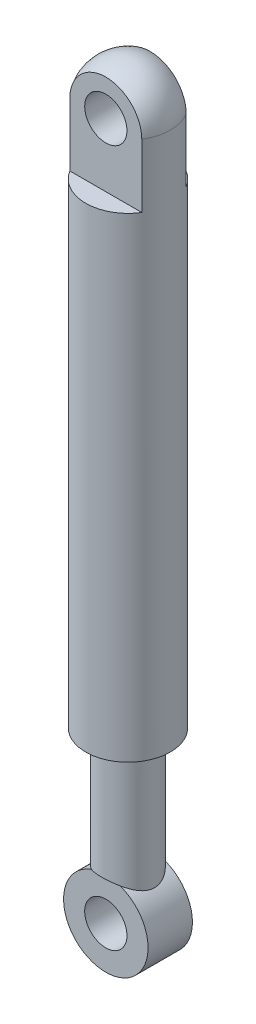
ISO-10303-21;
HEADER;
FILE_DESCRIPTION(('STEP AP214'),'2;1');
FILE_NAME('part.step','',(''),(''),'','','');
FILE_SCHEMA(('AUTOMOTIVE_DESIGN { 1 0 10303 214 1 1 1 1 }'));
ENDSEC;
DATA;
#1=APPLICATION_CONTEXT('core data for automotive mechanical design processes');
#2=APPLICATION_PROTOCOL_DEFINITION('international standard','automotive_design',2000,#1);
#3=PRODUCT_CONTEXT('',#1,'mechanical');
#4=PRODUCT('Part','Part','',(#3));
#5=PRODUCT_RELATED_PRODUCT_CATEGORY('part','',(#4));
#6=PRODUCT_DEFINITION_FORMATION('','',#4);
#7=PRODUCT_DEFINITION_CONTEXT('part definition',#1,'design');
#8=PRODUCT_DEFINITION('design','',#6,#7);
#9=PRODUCT_DEFINITION_SHAPE('','',#8);
#10=(LENGTH_UNIT() NAMED_UNIT(*) SI_UNIT(.MILLI.,.METRE.));
#11=(NAMED_UNIT(*) PLANE_ANGLE_UNIT() SI_UNIT($,.RADIAN.));
#12=(NAMED_UNIT(*) SI_UNIT($,.STERADIAN.) SOLID_ANGLE_UNIT());
#13=UNCERTAINTY_MEASURE_WITH_UNIT(LENGTH_MEASURE(1.E-05),#10,'distance_accuracy_value','');
#14=(GEOMETRIC_REPRESENTATION_CONTEXT(3) GLOBAL_UNCERTAINTY_ASSIGNED_CONTEXT((#13)) GLOBAL_UNIT_ASSIGNED_CONTEXT((#10,
#11,#12)) REPRESENTATION_CONTEXT('',''));
#15=CARTESIAN_POINT('',(0.,0.,0.));
#16=DIRECTION('',(0.,0.,1.));
#17=DIRECTION('',(1.,0.,0.));
#18=AXIS2_PLACEMENT_3D('',#15,#16,#17);
#19=CARTESIAN_POINT('',(0.,0.,0.));
#20=DIRECTION('',(0.,-1.,0.));
#21=DIRECTION('',(0.,0.,-1.));
#22=AXIS2_PLACEMENT_3D('',#19,#20,#21);
#23=CYLINDRICAL_SURFACE('',#22,4.00000000000001);
#24=CARTESIAN_POINT('',(0.,0.,0.));
#25=DIRECTION('',(0.,-1.,0.));
#26=DIRECTION('',(0.,0.,-1.));
#27=AXIS2_PLACEMENT_3D('',#24,#25,#26);
#28=CIRCLE('',#27,4.00000000000001);
#29=CARTESIAN_POINT('',(0.,0.,-4.00000000000001));
#30=VERTEX_POINT('',#29);
#31=EDGE_CURVE('E149',#30,#30,#28,.T.);
#32=ORIENTED_EDGE('',*,*,#31,.F.);
#33=EDGE_LOOP('',(#32));
#34=FACE_BOUND('',#33,.T.);
#35=CARTESIAN_POINT('',(0.,45.,0.));
#36=DIRECTION('',(0.,1.,0.));
#37=DIRECTION('',(0.,0.,1.));
#38=AXIS2_PLACEMENT_3D('',#35,#36,#37);
#39=CIRCLE('',#38,4.00000000000001);
#40=CARTESIAN_POINT('',(-3.40440890610985,45.,-2.1));
#41=VERTEX_POINT('',#40);
#42=CARTESIAN_POINT('',(3.40440890610985,45.,-2.1));
#43=VERTEX_POINT('',#42);
#44=EDGE_CURVE('E11',#41,#43,#39,.F.);
#45=ORIENTED_EDGE('',*,*,#44,.T.);
#46=DIRECTION('',(0.,-1.,0.));
#47=VECTOR('',#46,1.);
#48=CARTESIAN_POINT('',(3.40440890610985,0.,-2.09999999999999));
#49=LINE('',#48,#47);
#50=CARTESIAN_POINT('',(3.40440890610985,51.,-2.1));
#51=VERTEX_POINT('',#50);
#52=EDGE_CURVE('E102',#43,#51,#49,.F.);
#53=ORIENTED_EDGE('',*,*,#52,.T.);
#54=CARTESIAN_POINT('',(0.,51.,0.));
#55=DIRECTION('',(0.,-1.,0.));
#56=DIRECTION('',(0.,0.,-1.));
#57=AXIS2_PLACEMENT_3D('',#54,#55,#56);
#58=CIRCLE('',#57,4.00000000000001);
#59=CARTESIAN_POINT('',(3.40440890610985,51.,2.1));
#60=VERTEX_POINT('',#59);
#61=EDGE_CURVE('E146',#51,#60,#58,.T.);
#62=ORIENTED_EDGE('',*,*,#61,.T.);
#63=DIRECTION('',(0.,-1.,0.));
#64=VECTOR('',#63,1.);
#65=CARTESIAN_POINT('',(3.40440890610985,0.,2.09999999999999));
#66=LINE('',#65,#64);
#67=CARTESIAN_POINT('',(3.40440890610985,45.,2.1));
#68=VERTEX_POINT('',#67);
#69=EDGE_CURVE('E70',#68,#60,#66,.F.);
#70=ORIENTED_EDGE('',*,*,#69,.F.);
#71=CARTESIAN_POINT('',(0.,45.,0.));
#72=DIRECTION('',(0.,-1.,0.));
#73=DIRECTION('',(0.,0.,-1.));
#74=AXIS2_PLACEMENT_3D('',#71,#72,#73);
#75=CIRCLE('',#74,4.00000000000001);
#76=CARTESIAN_POINT('',(-3.40440890610985,45.,2.1));
#77=VERTEX_POINT('',#76);
#78=EDGE_CURVE('E65',#77,#68,#75,.F.);
#79=ORIENTED_EDGE('',*,*,#78,.F.);
#80=DIRECTION('',(0.,-1.,0.));
#81=VECTOR('',#80,1.);
#82=CARTESIAN_POINT('',(-3.40440890610985,0.,2.09999999999999));
#83=LINE('',#82,#81);
#84=CARTESIAN_POINT('',(-3.40440890610985,51.,2.1));
#85=VERTEX_POINT('',#84);
#86=EDGE_CURVE('E128',#85,#77,#83,.T.);
#87=ORIENTED_EDGE('',*,*,#86,.F.);
#88=CARTESIAN_POINT('',(-3.40440890610985,51.,-2.1));
#89=VERTEX_POINT('',#88);
#90=EDGE_CURVE('E120',#85,#89,#58,.T.);
#91=ORIENTED_EDGE('',*,*,#90,.T.);
#92=DIRECTION('',(0.,-1.,0.));
#93=VECTOR('',#92,1.);
#94=CARTESIAN_POINT('',(-3.40440890610985,0.,-2.09999999999999));
#95=LINE('',#94,#93);
#96=EDGE_CURVE('E111',#89,#41,#95,.T.);
#97=ORIENTED_EDGE('',*,*,#96,.T.);
#98=EDGE_LOOP('',(#45,#53,#62,#70,#79,#87,#91,#97));
#99=FACE_BOUND('',#98,.T.);
#100=ADVANCED_FACE('F47',(#34,#99),#23,.T.);
#101=CARTESIAN_POINT('',(0.,51.,0.));
#102=DIRECTION('',(0.,-1.,0.));
#103=DIRECTION('',(1.,0.,0.));
#104=AXIS2_PLACEMENT_3D('',#101,#102,#103);
#105=SPHERICAL_SURFACE('',#104,4.00000000000001);
#106=CARTESIAN_POINT('',(0.,51.,-2.1));
#107=DIRECTION('',(0.,0.,-1.));
#108=DIRECTION('',(0.,1.,0.));
#109=AXIS2_PLACEMENT_3D('',#106,#107,#108);
#110=CIRCLE('',#109,3.40440890610985);
#111=EDGE_CURVE('E57',#51,#89,#110,.F.);
#112=ORIENTED_EDGE('',*,*,#111,.T.);
#113=ORIENTED_EDGE('',*,*,#90,.F.);
#114=CARTESIAN_POINT('',(0.,51.,2.1));
#115=DIRECTION('',(0.,0.,-1.));
#116=DIRECTION('',(0.,1.,0.));
#117=AXIS2_PLACEMENT_3D('',#114,#115,#116);
#118=CIRCLE('',#117,3.40440890610985);
#119=EDGE_CURVE('E162',#60,#85,#118,.F.);
#120=ORIENTED_EDGE('',*,*,#119,.F.);
#121=ORIENTED_EDGE('',*,*,#61,.F.);
#122=EDGE_LOOP('',(#112,#113,#120,#121));
#123=FACE_BOUND('',#122,.T.);
#124=ADVANCED_FACE('F211',(#123),#105,.T.);
#125=CARTESIAN_POINT('',(0.,-15.,-4.00000000000001));
#126=DIRECTION('',(0.,0.,1.));
#127=DIRECTION('',(1.,0.,0.));
#128=AXIS2_PLACEMENT_3D('',#125,#126,#127);
#129=CYLINDRICAL_SURFACE('',#128,4.);
#130=CARTESIAN_POINT('',(0.,-15.,-2.1));
#131=DIRECTION('',(0.,0.,1.));
#132=DIRECTION('',(1.,0.,0.));
#133=AXIS2_PLACEMENT_3D('',#130,#131,#132);
#134=CIRCLE('',#133,4.);
#135=CARTESIAN_POINT('',(1.35646599662505,-11.2370224555546,-2.1));
#136=VERTEX_POINT('',#135);
#137=CARTESIAN_POINT('',(-1.35646599662505,-11.2370224555546,-2.1));
#138=VERTEX_POINT('',#137);
#139=EDGE_CURVE('E140',#136,#138,#134,.T.);
#140=ORIENTED_EDGE('',*,*,#139,.T.);
#141=CARTESIAN_POINT('',(-2.5,-11.8775010008008,0.));
#142=CARTESIAN_POINT('',(-2.49999941097139,-11.8775000844458,-0.0621567514455108));
#143=CARTESIAN_POINT('',(-2.49767581942173,-11.8756350926608,-0.124325946670792));
#144=CARTESIAN_POINT('',(-2.48843349840856,-11.8682707688097,-0.248117179547742));
#145=CARTESIAN_POINT('',(-2.48151206248433,-11.8627692961864,-0.309738873257102));
#146=CARTESIAN_POINT('',(-2.45397595058365,-11.841110464415,-0.493226047743712));
#147=CARTESIAN_POINT('',(-2.42658990946459,-11.8197996372886,-0.613548331188979));
#148=CARTESIAN_POINT('',(-2.35576217141197,-11.7670022923963,-0.845598197878236));
#149=CARTESIAN_POINT('',(-2.31245961359202,-11.7356042461679,-0.957390415055104));
#150=CARTESIAN_POINT('',(-2.21143916430899,-11.6663399911556,-1.17200852533406));
#151=CARTESIAN_POINT('',(-2.15372087963017,-11.6284736059447,-1.27483417375309));
#152=CARTESIAN_POINT('',(-2.01647682425577,-11.5444077487812,-1.48373398130366));
#153=CARTESIAN_POINT('',(-1.93506425666948,-11.4977718548842,-1.58839332500452));
#154=CARTESIAN_POINT('',(-1.75662526657431,-11.4049449646663,-1.7837615516238));
#155=CARTESIAN_POINT('',(-1.65958538899782,-11.3587543884156,-1.87445827995362));
#156=CARTESIAN_POINT('',(-1.43833990582854,-11.2654047522869,-2.05022029817268));
#157=CARTESIAN_POINT('',(-1.31226934259651,-11.218801122185,-2.13328618445043));
#158=CARTESIAN_POINT('',(-1.11163395543429,-11.1569274816123,-2.24054515473624));
#159=CARTESIAN_POINT('',(-1.04281240974104,-11.1376371690795,-2.27341513833311));
#160=CARTESIAN_POINT('',(-0.901758767615548,-11.1022956302456,-2.33295468536328));
#161=CARTESIAN_POINT('',(-0.829529068393795,-11.0862421679288,-2.35962853103842));
#162=CARTESIAN_POINT('',(-0.689700297916575,-11.0593324088618,-2.40398381525628));
#163=CARTESIAN_POINT('',(-0.622371981278587,-11.0481146401553,-2.42230197651811));
#164=CARTESIAN_POINT('',(-0.485997575898807,-11.0290375809084,-2.45330228631336));
#165=CARTESIAN_POINT('',(-0.416952503441681,-11.0211763512028,-2.46598768921621));
#166=CARTESIAN_POINT('',(-0.277765449857172,-11.0090452966526,-2.48551379763454));
#167=CARTESIAN_POINT('',(-0.207624174243904,-11.0047732515217,-2.49235811651341));
#168=CARTESIAN_POINT('',(-0.0669114466599372,-10.9999387492756,-2.50009921338922));
#169=CARTESIAN_POINT('',(0.00365995486028072,-10.9993758651775,-2.50099667596335));
#170=CARTESIAN_POINT('',(0.19604508155554,-11.002955203805,-2.49527462645275));
#171=CARTESIAN_POINT('',(0.317681845488537,-11.0108295910256,-2.48269349692112));
#172=CARTESIAN_POINT('',(0.556636494620257,-11.0370909672407,-2.44026978203388));
#173=CARTESIAN_POINT('',(0.673954052677428,-11.0554787507952,-2.41042589202638));
#174=CARTESIAN_POINT('',(0.901771991763868,-11.1012382928839,-2.33479144071674));
#175=CARTESIAN_POINT('',(1.01225407159607,-11.1286330261895,-2.28896008042893));
#176=CARTESIAN_POINT('',(1.22404012071223,-11.1902870824865,-2.18306276101571));
#177=CARTESIAN_POINT('',(1.32534199174245,-11.2245479691068,-2.12299355893635));
#178=CARTESIAN_POINT('',(1.52942649744659,-11.3021355875283,-1.98194358307633));
#179=CARTESIAN_POINT('',(1.63082454612907,-11.3460599361848,-1.89929072330952));
#180=CARTESIAN_POINT('',(1.81919733573063,-11.4360907225949,-1.71973526279293));
#181=CARTESIAN_POINT('',(1.90615071842624,-11.4822002642959,-1.62281195361603));
#182=CARTESIAN_POINT('',(2.07470887167909,-11.5785711653553,-1.40258874682652));
#183=CARTESIAN_POINT('',(2.15413229677844,-11.628588373134,-1.27749723664192));
#184=CARTESIAN_POINT('',(2.29052307550563,-11.7197172180762,-1.01270776269859));
#185=CARTESIAN_POINT('',(2.34753179448504,-11.7608451961307,-0.873037312546895));
#186=CARTESIAN_POINT('',(2.42437133527931,-11.8181624686824,-0.620461193893754));
#187=CARTESIAN_POINT('',(2.45003683445404,-11.8380659139749,-0.510178074786513));
#188=CARTESIAN_POINT('',(2.48620337073091,-11.8664172224045,-0.285769622440113));
#189=CARTESIAN_POINT('',(2.49672512520811,-11.8748807349556,-0.171649757343195));
#190=CARTESIAN_POINT('',(2.5019707209518,-11.8790773296932,0.0574573605024472));
#191=CARTESIAN_POINT('',(2.49665835896695,-11.8747812382981,0.172446000478453));
#192=CARTESIAN_POINT('',(2.47051466367814,-11.8540791416381,0.399561164318477));
#193=CARTESIAN_POINT('',(2.44967047849126,-11.8376631077709,0.511685238371181));
#194=CARTESIAN_POINT('',(2.39409874195038,-11.7953987920286,0.728436759425691));
#195=CARTESIAN_POINT('',(2.35960571424758,-11.7697104563218,0.833157315894324));
#196=CARTESIAN_POINT('',(2.27804893702243,-11.7116885161125,1.03557469989379));
#197=CARTESIAN_POINT('',(2.23098072583747,-11.6793525539792,1.13326901887797));
#198=CARTESIAN_POINT('',(2.11530798730694,-11.604255987148,1.33861194166319));
#199=CARTESIAN_POINT('',(2.04430931160544,-11.5606827570698,1.44461452730177));
#200=CARTESIAN_POINT('',(1.88737868921489,-11.4721205678666,1.64437066065426));
#201=CARTESIAN_POINT('',(1.80143124902619,-11.4271301799553,1.73811132124234));
#202=CARTESIAN_POINT('',(1.60076932492121,-11.332337905405,1.92596407064096));
#203=CARTESIAN_POINT('',(1.48365201617177,-11.282920661168,2.01772739848491));
#204=CARTESIAN_POINT('',(1.23256787407809,-11.1923102660139,2.18014701471972));
#205=CARTESIAN_POINT('',(1.09860897940974,-11.1511132638099,2.25081319512692));
#206=CARTESIAN_POINT('',(0.89193080465508,-11.1001103350022,2.33658106797499));
#207=CARTESIAN_POINT('',(0.824318196039419,-11.0852294490275,2.36129744395128));
#208=CARTESIAN_POINT('',(0.686640792876422,-11.0587535608138,2.40493827673228));
#209=CARTESIAN_POINT('',(0.616577444051134,-11.0471566568519,2.42386608615092));
#210=CARTESIAN_POINT('',(0.474639231464261,-11.0276148796005,2.45560583013925));
#211=CARTESIAN_POINT('',(0.402766005755506,-11.0196668209116,2.46842309951643));
#212=CARTESIAN_POINT('',(0.25788180714246,-11.0076583165666,2.48773917229289));
#213=CARTESIAN_POINT('',(0.184871024482533,-11.0035972277998,2.49423902093079));
#214=CARTESIAN_POINT('',(-0.0131102774248943,-10.9980847850729,2.50307151550711));
#215=CARTESIAN_POINT('',(-0.138539079205451,-11.0004729387605,2.49926579290941));
#216=CARTESIAN_POINT('',(-0.386583137102133,-11.0167802498164,2.47308241045447));
#217=CARTESIAN_POINT('',(-0.509198520626832,-11.0306988839514,2.45070559332119));
#218=CARTESIAN_POINT('',(-0.744080605483851,-11.0680791661572,2.38967758445389));
#219=CARTESIAN_POINT('',(-0.856558752631813,-11.091192989452,2.35161792643533));
#220=CARTESIAN_POINT('',(-1.07343034721918,-11.1451002875116,2.26088053755652));
#221=CARTESIAN_POINT('',(-1.17782242685803,-11.1758950578469,2.2082003404328));
#222=CARTESIAN_POINT('',(-1.38731297754797,-11.2464932606435,2.08367872128004));
#223=CARTESIAN_POINT('',(-1.4913601218378,-11.2868999813534,2.0104160092425));
#224=CARTESIAN_POINT('',(-1.68643334934803,-11.3713271601479,1.84984676748589));
#225=CARTESIAN_POINT('',(-1.77744451843681,-11.415351668088,1.76252439116572));
#226=CARTESIAN_POINT('',(-1.95744716561589,-11.5099917178028,1.56176748493813));
#227=CARTESIAN_POINT('',(-2.04425661250063,-11.560642615729,1.44638338742857));
#228=CARTESIAN_POINT('',(-2.19754648509904,-11.6565035254289,1.20071059024024));
#229=CARTESIAN_POINT('',(-2.26403815415027,-11.7017165379581,1.07043018884747));
#230=CARTESIAN_POINT('',(-2.3619822941284,-11.7714046021991,0.827194699215084));
#231=CARTESIAN_POINT('',(-2.39792458576829,-11.7982536066123,0.716729427846441));
#232=CARTESIAN_POINT('',(-2.45425618419746,-11.8412164189549,0.490060656998223));
#233=CARTESIAN_POINT('',(-2.47469472410168,-11.8573641884957,0.37387658020028));
#234=CARTESIAN_POINT('',(-2.49119847139522,-11.8704714235939,0.213940005353927));
#235=CARTESIAN_POINT('',(-2.49449433837959,-11.8731000569323,0.171274474291342));
#236=CARTESIAN_POINT('',(-2.49889558125807,-11.8766153806014,0.0857413010482517));
#237=CARTESIAN_POINT('',(-2.50000040629188,-11.8775016328713,0.0428736107566455));
#238=CARTESIAN_POINT('',(-2.5,-11.8775010008008,0.));
#239=B_SPLINE_CURVE_WITH_KNOTS('',3,(#141,#142,#143,#144,#145,#146,#147,#148,#149,#150,#151,
#152,#153,#154,#155,#156,#157,#158,#159,#160,#161,#162,#163,#164,#165,#166,#167,#168,#169,#170,
#171,#172,#173,#174,#175,#176,#177,#178,#179,#180,#181,#182,#183,#184,#185,#186,#187,#188,#189,
#190,#191,#192,#193,#194,#195,#196,#197,#198,#199,#200,#201,#202,#203,#204,#205,#206,#207,#208,
#209,#210,#211,#212,#213,#214,#215,#216,#217,#218,#219,#220,#221,#222,#223,#224,#225,#226,#227,
#228,#229,#230,#231,#232,#233,#234,#235,#236,#237,#238),.UNSPECIFIED.,.T.,.F.,(4,2,2,2,2,2,2,2,
2,2,2,2,2,2,2,2,2,2,2,2,2,2,2,2,2,2,2,2,2,2,2,2,2,2,2,2,2,2,2,2,2,2,2,2,2,2,2,2,4),(0.,
0.18641531585846,0.372940459994496,0.746478880764687,1.11682668423133,1.48718459072605,
1.90722798685071,2.32763499192879,2.7987602926597,3.03445880867314,3.26999394209509,
3.48170145743205,3.69328649746504,3.90474055342595,4.11617026725867,4.48184709708114,
4.84755156693919,5.21419620193004,5.58092442797434,5.99329080205307,6.40626158573465,
6.87316206383505,7.33919680735486,7.68265621505466,8.02564530559509,8.36941921026407,
8.7134778886509,9.05186495232125,9.390372235192,9.79332737765188,10.1967026751544,
10.6647326786671,11.1325428866818,11.3527929661039,11.5729152387446,11.7928449800804,
12.0127383271002,12.3871595324234,12.7615637480926,13.1229788842094,13.4844550226785,
13.8834503840958,14.2828986410983,14.7399238503459,15.1966956936287,15.5530255473292,
15.9082190611886,16.0367696833384,16.1653526209168),.UNSPECIFIED.);
#240=EDGE_CURVE('E154',#138,#136,#239,.T.);
#241=ORIENTED_EDGE('',*,*,#240,.T.);
#242=EDGE_LOOP('',(#140,#241));
#243=FACE_BOUND('',#242,.T.);
#244=ADVANCED_FACE('F174',(#243),#129,.F.);
#245=CARTESIAN_POINT('',(0.,0.,0.));
#246=DIRECTION('',(0.,-1.,0.));
#247=DIRECTION('',(0.,0.,-1.));
#248=AXIS2_PLACEMENT_3D('',#245,#246,#247);
#249=PLANE('',#248);
#250=CARTESIAN_POINT('',(0.,0.,0.));
#251=DIRECTION('',(0.,1.,0.));
#252=DIRECTION('',(-1.,0.,0.));
#253=AXIS2_PLACEMENT_3D('',#250,#251,#252);
#254=CIRCLE('',#253,2.5);
#255=CARTESIAN_POINT('',(-2.5,0.,0.));
#256=VERTEX_POINT('',#255);
#257=EDGE_CURVE('E138',#256,#256,#254,.T.);
#258=ORIENTED_EDGE('',*,*,#257,.T.);
#259=EDGE_LOOP('',(#258));
#260=FACE_BOUND('',#259,.T.);
#261=ORIENTED_EDGE('',*,*,#31,.T.);
#262=EDGE_LOOP('',(#261));
#263=FACE_BOUND('',#262,.T.);
#264=ADVANCED_FACE('F49',(#260,#263),#249,.T.);
#265=CARTESIAN_POINT('',(0.,0.,0.));
#266=DIRECTION('',(0.,1.,0.));
#267=DIRECTION('',(-1.,0.,0.));
#268=AXIS2_PLACEMENT_3D('',#265,#266,#267);
#269=CYLINDRICAL_SURFACE('',#268,2.5);
#270=ORIENTED_EDGE('',*,*,#240,.F.);
#271=CARTESIAN_POINT('',(-1.35646599662505,-11.2370224555546,2.1));
#272=VERTEX_POINT('',#271);
#273=EDGE_CURVE('E153',#272,#138,#239,.T.);
#274=ORIENTED_EDGE('',*,*,#273,.F.);
#275=CARTESIAN_POINT('',(1.35646599662505,-11.2370224555546,2.1));
#276=VERTEX_POINT('',#275);
#277=EDGE_CURVE('E244',#276,#272,#239,.T.);
#278=ORIENTED_EDGE('',*,*,#277,.F.);
#279=EDGE_CURVE('E163',#136,#276,#239,.T.);
#280=ORIENTED_EDGE('',*,*,#279,.F.);
#281=EDGE_LOOP('',(#270,#274,#278,#280));
#282=FACE_BOUND('',#281,.T.);
#283=ORIENTED_EDGE('',*,*,#257,.F.);
#284=EDGE_LOOP('',(#283));
#285=FACE_BOUND('',#284,.T.);
#286=ADVANCED_FACE('F165',(#282,#285),#269,.T.);
#287=ORIENTED_EDGE('',*,*,#277,.T.);
#288=CARTESIAN_POINT('',(0.,-15.,2.1));
#289=DIRECTION('',(0.,0.,1.));
#290=DIRECTION('',(1.,0.,0.));
#291=AXIS2_PLACEMENT_3D('',#288,#289,#290);
#292=CIRCLE('',#291,4.);
#293=EDGE_CURVE('E134',#276,#272,#292,.T.);
#294=ORIENTED_EDGE('',*,*,#293,.F.);
#295=EDGE_LOOP('',(#287,#294));
#296=FACE_BOUND('',#295,.T.);
#297=ADVANCED_FACE('F168',(#296),#129,.F.);
#298=CARTESIAN_POINT('',(0.,-15.,2.1));
#299=DIRECTION('',(0.,0.,-1.));
#300=DIRECTION('',(-1.,0.,0.));
#301=AXIS2_PLACEMENT_3D('',#298,#299,#300);
#302=CYLINDRICAL_SURFACE('',#301,4.);
#303=ORIENTED_EDGE('',*,*,#279,.T.);
#304=EDGE_CURVE('E139',#272,#276,#292,.T.);
#305=ORIENTED_EDGE('',*,*,#304,.F.);
#306=ORIENTED_EDGE('',*,*,#273,.T.);
#307=EDGE_CURVE('E133',#138,#136,#134,.T.);
#308=ORIENTED_EDGE('',*,*,#307,.T.);
#309=EDGE_LOOP('',(#303,#305,#306,#308));
#310=FACE_BOUND('',#309,.T.);
#311=ADVANCED_FACE('F172',(#310),#302,.T.);
#312=CARTESIAN_POINT('',(0.,-15.,2.1));
#313=DIRECTION('',(0.,0.,1.));
#314=DIRECTION('',(1.,0.,0.));
#315=AXIS2_PLACEMENT_3D('',#312,#313,#314);
#316=PLANE('',#315);
#317=CARTESIAN_POINT('',(0.,-15.,2.1));
#318=DIRECTION('',(0.,0.,1.));
#319=DIRECTION('',(1.,0.,0.));
#320=AXIS2_PLACEMENT_3D('',#317,#318,#319);
#321=CIRCLE('',#320,2.);
#322=CARTESIAN_POINT('',(2.,-15.,2.1));
#323=VERTEX_POINT('',#322);
#324=EDGE_CURVE('E116',#323,#323,#321,.T.);
#325=ORIENTED_EDGE('',*,*,#324,.F.);
#326=EDGE_LOOP('',(#325));
#327=FACE_BOUND('',#326,.T.);
#328=ORIENTED_EDGE('',*,*,#293,.T.);
#329=ORIENTED_EDGE('',*,*,#304,.T.);
#330=EDGE_LOOP('',(#328,#329));
#331=FACE_BOUND('',#330,.T.);
#332=ADVANCED_FACE('F177',(#327,#331),#316,.T.);
#333=CARTESIAN_POINT('',(0.,-15.,-2.1));
#334=DIRECTION('',(0.,0.,1.));
#335=DIRECTION('',(1.,0.,0.));
#336=AXIS2_PLACEMENT_3D('',#333,#334,#335);
#337=PLANE('',#336);
#338=CARTESIAN_POINT('',(0.,-15.,-2.1));
#339=DIRECTION('',(0.,0.,1.));
#340=DIRECTION('',(1.,0.,0.));
#341=AXIS2_PLACEMENT_3D('',#338,#339,#340);
#342=CIRCLE('',#341,2.);
#343=CARTESIAN_POINT('',(2.,-15.,-2.1));
#344=VERTEX_POINT('',#343);
#345=EDGE_CURVE('E51',#344,#344,#342,.T.);
#346=ORIENTED_EDGE('',*,*,#345,.T.);
#347=EDGE_LOOP('',(#346));
#348=FACE_BOUND('',#347,.T.);
#349=ORIENTED_EDGE('',*,*,#139,.F.);
#350=ORIENTED_EDGE('',*,*,#307,.F.);
#351=EDGE_LOOP('',(#349,#350));
#352=FACE_BOUND('',#351,.T.);
#353=ADVANCED_FACE('F179',(#348,#352),#337,.F.);
#354=CARTESIAN_POINT('',(95.2704188568458,54.4044089061099,2.1));
#355=DIRECTION('',(0.,0.,-1.));
#356=DIRECTION('',(0.,1.,0.));
#357=AXIS2_PLACEMENT_3D('',#354,#355,#356);
#358=PLANE('',#357);
#359=CARTESIAN_POINT('',(0.,51.,2.1));
#360=DIRECTION('',(0.,0.,-1.));
#361=DIRECTION('',(0.,1.,0.));
#362=AXIS2_PLACEMENT_3D('',#359,#360,#361);
#363=CIRCLE('',#362,2.);
#364=CARTESIAN_POINT('',(0.,53.,2.1));
#365=VERTEX_POINT('',#364);
#366=EDGE_CURVE('E256',#365,#365,#363,.T.);
#367=ORIENTED_EDGE('',*,*,#366,.T.);
#368=EDGE_LOOP('',(#367));
#369=FACE_BOUND('',#368,.T.);
#370=DIRECTION('',(-1.,0.,0.));
#371=VECTOR('',#370,1.);
#372=CARTESIAN_POINT('',(95.2704188568458,45.,2.1));
#373=LINE('',#372,#371);
#374=EDGE_CURVE('E110',#68,#77,#373,.T.);
#375=ORIENTED_EDGE('',*,*,#374,.F.);
#376=ORIENTED_EDGE('',*,*,#69,.T.);
#377=ORIENTED_EDGE('',*,*,#119,.T.);
#378=ORIENTED_EDGE('',*,*,#86,.T.);
#379=EDGE_LOOP('',(#375,#376,#377,#378));
#380=FACE_BOUND('',#379,.T.);
#381=ADVANCED_FACE('F182',(#369,#380),#358,.F.);
#382=CARTESIAN_POINT('',(95.2704188568458,45.,2.1));
#383=DIRECTION('',(0.,-1.,0.));
#384=DIRECTION('',(0.,0.,-1.));
#385=AXIS2_PLACEMENT_3D('',#382,#383,#384);
#386=PLANE('',#385);
#387=ORIENTED_EDGE('',*,*,#374,.T.);
#388=ORIENTED_EDGE('',*,*,#78,.T.);
#389=EDGE_LOOP('',(#387,#388));
#390=FACE_BOUND('',#389,.T.);
#391=ADVANCED_FACE('F189',(#390),#386,.F.);
#392=CARTESIAN_POINT('',(95.2704188568458,54.4044089061099,-2.1));
#393=DIRECTION('',(0.,0.,-1.));
#394=DIRECTION('',(0.,1.,0.));
#395=AXIS2_PLACEMENT_3D('',#392,#393,#394);
#396=PLANE('',#395);
#397=CARTESIAN_POINT('',(0.,51.,-2.1));
#398=DIRECTION('',(0.,0.,-1.));
#399=DIRECTION('',(0.,1.,0.));
#400=AXIS2_PLACEMENT_3D('',#397,#398,#399);
#401=CIRCLE('',#400,2.);
#402=CARTESIAN_POINT('',(0.,53.,-2.1));
#403=VERTEX_POINT('',#402);
#404=EDGE_CURVE('E254',#403,#403,#401,.T.);
#405=ORIENTED_EDGE('',*,*,#404,.F.);
#406=EDGE_LOOP('',(#405));
#407=FACE_BOUND('',#406,.T.);
#408=ORIENTED_EDGE('',*,*,#52,.F.);
#409=DIRECTION('',(-1.,0.,0.));
#410=VECTOR('',#409,1.);
#411=CARTESIAN_POINT('',(95.2704188568458,45.,-2.1));
#412=LINE('',#411,#410);
#413=EDGE_CURVE('E106',#43,#41,#412,.T.);
#414=ORIENTED_EDGE('',*,*,#413,.T.);
#415=ORIENTED_EDGE('',*,*,#96,.F.);
#416=ORIENTED_EDGE('',*,*,#111,.F.);
#417=EDGE_LOOP('',(#408,#414,#415,#416));
#418=FACE_BOUND('',#417,.T.);
#419=ADVANCED_FACE('F104',(#407,#418),#396,.T.);
#420=CARTESIAN_POINT('',(95.2704188568458,45.,-2.1));
#421=DIRECTION('',(0.,1.,0.));
#422=DIRECTION('',(0.,0.,1.));
#423=AXIS2_PLACEMENT_3D('',#420,#421,#422);
#424=PLANE('',#423);
#425=ORIENTED_EDGE('',*,*,#44,.F.);
#426=ORIENTED_EDGE('',*,*,#413,.F.);
#427=EDGE_LOOP('',(#425,#426));
#428=FACE_BOUND('',#427,.T.);
#429=ADVANCED_FACE('F114',(#428),#424,.T.);
#430=CARTESIAN_POINT('',(0.,51.,-4.00000000000001));
#431=DIRECTION('',(0.,0.,1.));
#432=DIRECTION('',(1.,0.,0.));
#433=AXIS2_PLACEMENT_3D('',#430,#431,#432);
#434=CYLINDRICAL_SURFACE('',#433,2.);
#435=ORIENTED_EDGE('',*,*,#404,.T.);
#436=EDGE_LOOP('',(#435));
#437=FACE_BOUND('',#436,.T.);
#438=ORIENTED_EDGE('',*,*,#366,.F.);
#439=EDGE_LOOP('',(#438));
#440=FACE_BOUND('',#439,.T.);
#441=ADVANCED_FACE('F199',(#437,#440),#434,.F.);
#442=CARTESIAN_POINT('',(0.,-15.,-4.00000000000001));
#443=DIRECTION('',(0.,0.,1.));
#444=DIRECTION('',(1.,0.,0.));
#445=AXIS2_PLACEMENT_3D('',#442,#443,#444);
#446=CYLINDRICAL_SURFACE('',#445,2.);
#447=ORIENTED_EDGE('',*,*,#324,.T.);
#448=EDGE_LOOP('',(#447));
#449=FACE_BOUND('',#448,.T.);
#450=ORIENTED_EDGE('',*,*,#345,.F.);
#451=EDGE_LOOP('',(#450));
#452=FACE_BOUND('',#451,.T.);
#453=ADVANCED_FACE('F200',(#449,#452),#446,.F.);
#454=CLOSED_SHELL('',(#100,#124,#244,#264,#286,#297,#311,#332,#353,#381,#391,#419,#429,#441,#453));
#455=MANIFOLD_SOLID_BREP('B2',#454);
#456=ADVANCED_BREP_SHAPE_REPRESENTATION('',(#18,#455),#14);
#457=SHAPE_DEFINITION_REPRESENTATION(#9,#456);
ENDSEC;
END-ISO-10303-21;
